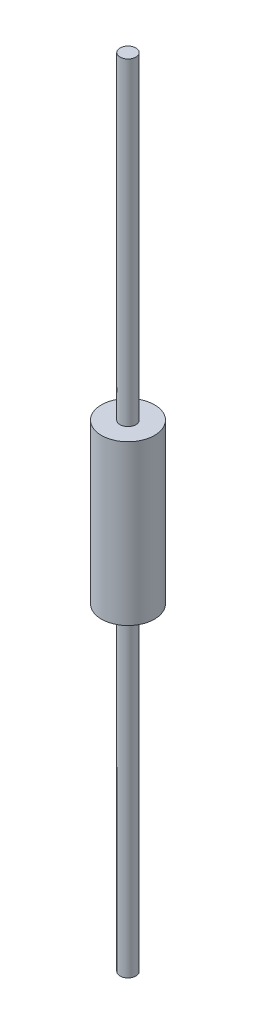
ISO-10303-21;
HEADER;
FILE_DESCRIPTION(('STEP AP214'),'2;1');
FILE_NAME('part.step','',(''),(''),'','','');
FILE_SCHEMA(('AUTOMOTIVE_DESIGN { 1 0 10303 214 1 1 1 1 }'));
ENDSEC;
DATA;
#1=APPLICATION_CONTEXT('core data for automotive mechanical design processes');
#2=APPLICATION_PROTOCOL_DEFINITION('international standard','automotive_design',2000,#1);
#3=PRODUCT_CONTEXT('',#1,'mechanical');
#4=PRODUCT('Part','Part','',(#3));
#5=PRODUCT_RELATED_PRODUCT_CATEGORY('part','',(#4));
#6=PRODUCT_DEFINITION_FORMATION('','',#4);
#7=PRODUCT_DEFINITION_CONTEXT('part definition',#1,'design');
#8=PRODUCT_DEFINITION('design','',#6,#7);
#9=PRODUCT_DEFINITION_SHAPE('','',#8);
#10=(LENGTH_UNIT() NAMED_UNIT(*) SI_UNIT(.MILLI.,.METRE.));
#11=(NAMED_UNIT(*) PLANE_ANGLE_UNIT() SI_UNIT($,.RADIAN.));
#12=(NAMED_UNIT(*) SI_UNIT($,.STERADIAN.) SOLID_ANGLE_UNIT());
#13=UNCERTAINTY_MEASURE_WITH_UNIT(LENGTH_MEASURE(1.E-05),#10,'distance_accuracy_value','');
#14=(GEOMETRIC_REPRESENTATION_CONTEXT(3) GLOBAL_UNCERTAINTY_ASSIGNED_CONTEXT((#13)) GLOBAL_UNIT_ASSIGNED_CONTEXT((#10,
#11,#12)) REPRESENTATION_CONTEXT('',''));
#15=CARTESIAN_POINT('',(0.,0.,0.));
#16=DIRECTION('',(0.,0.,1.));
#17=DIRECTION('',(1.,0.,0.));
#18=AXIS2_PLACEMENT_3D('',#15,#16,#17);
#19=CARTESIAN_POINT('',(0.,3.,0.));
#20=DIRECTION('',(0.,-1.,0.));
#21=DIRECTION('',(0.,0.,-1.));
#22=AXIS2_PLACEMENT_3D('',#19,#20,#21);
#23=CYLINDRICAL_SURFACE('',#22,0.5);
#24=CARTESIAN_POINT('',(0.,3.,0.));
#25=DIRECTION('',(0.,1.,0.));
#26=DIRECTION('',(0.,0.,1.));
#27=AXIS2_PLACEMENT_3D('',#24,#25,#26);
#28=CIRCLE('',#27,0.5);
#29=CARTESIAN_POINT('',(0.,3.,0.5));
#30=VERTEX_POINT('',#29);
#31=EDGE_CURVE('E42',#30,#30,#28,.T.);
#32=ORIENTED_EDGE('',*,*,#31,.F.);
#33=EDGE_LOOP('',(#32));
#34=FACE_BOUND('',#33,.T.);
#35=CARTESIAN_POINT('',(0.,0.,0.));
#36=DIRECTION('',(0.,1.,0.));
#37=DIRECTION('',(0.,0.,1.));
#38=AXIS2_PLACEMENT_3D('',#35,#36,#37);
#39=CIRCLE('',#38,0.5);
#40=CARTESIAN_POINT('',(0.,0.,0.5));
#41=VERTEX_POINT('',#40);
#42=EDGE_CURVE('E33',#41,#41,#39,.T.);
#43=ORIENTED_EDGE('',*,*,#42,.T.);
#44=EDGE_LOOP('',(#43));
#45=FACE_BOUND('',#44,.T.);
#46=ADVANCED_FACE('F30',(#34,#45),#23,.T.);
#47=CARTESIAN_POINT('',(0.,3.,0.));
#48=DIRECTION('',(0.,1.,0.));
#49=DIRECTION('',(0.,0.,1.));
#50=AXIS2_PLACEMENT_3D('',#47,#48,#49);
#51=PLANE('',#50);
#52=CARTESIAN_POINT('',(0.,3.,0.));
#53=DIRECTION('',(0.,1.,0.));
#54=DIRECTION('',(0.,0.,1.));
#55=AXIS2_PLACEMENT_3D('',#52,#53,#54);
#56=CIRCLE('',#55,0.15);
#57=CARTESIAN_POINT('',(0.,3.,0.15));
#58=VERTEX_POINT('',#57);
#59=EDGE_CURVE('E37',#58,#58,#56,.T.);
#60=ORIENTED_EDGE('',*,*,#59,.F.);
#61=EDGE_LOOP('',(#60));
#62=FACE_BOUND('',#61,.T.);
#63=ORIENTED_EDGE('',*,*,#31,.T.);
#64=EDGE_LOOP('',(#63));
#65=FACE_BOUND('',#64,.T.);
#66=ADVANCED_FACE('F59',(#62,#65),#51,.T.);
#67=CARTESIAN_POINT('',(0.,0.,0.));
#68=DIRECTION('',(0.,1.,0.));
#69=DIRECTION('',(0.,0.,1.));
#70=AXIS2_PLACEMENT_3D('',#67,#68,#69);
#71=PLANE('',#70);
#72=CARTESIAN_POINT('',(0.,0.,0.));
#73=DIRECTION('',(0.,-1.,0.));
#74=DIRECTION('',(0.,0.,-1.));
#75=AXIS2_PLACEMENT_3D('',#72,#73,#74);
#76=CIRCLE('',#75,0.15);
#77=CARTESIAN_POINT('',(0.,0.,-0.15));
#78=VERTEX_POINT('',#77);
#79=EDGE_CURVE('E10',#78,#78,#76,.T.);
#80=ORIENTED_EDGE('',*,*,#79,.F.);
#81=EDGE_LOOP('',(#80));
#82=FACE_BOUND('',#81,.T.);
#83=ORIENTED_EDGE('',*,*,#42,.F.);
#84=EDGE_LOOP('',(#83));
#85=FACE_BOUND('',#84,.T.);
#86=ADVANCED_FACE('F56',(#82,#85),#71,.F.);
#87=CARTESIAN_POINT('',(0.,9.,0.));
#88=DIRECTION('',(0.,-1.,0.));
#89=DIRECTION('',(0.,0.,-1.));
#90=AXIS2_PLACEMENT_3D('',#87,#88,#89);
#91=CYLINDRICAL_SURFACE('',#90,0.15);
#92=CARTESIAN_POINT('',(0.,9.,0.));
#93=DIRECTION('',(0.,1.,0.));
#94=DIRECTION('',(0.,0.,1.));
#95=AXIS2_PLACEMENT_3D('',#92,#93,#94);
#96=CIRCLE('',#95,0.15);
#97=CARTESIAN_POINT('',(0.,9.,0.15));
#98=VERTEX_POINT('',#97);
#99=EDGE_CURVE('E47',#98,#98,#96,.T.);
#100=ORIENTED_EDGE('',*,*,#99,.F.);
#101=EDGE_LOOP('',(#100));
#102=FACE_BOUND('',#101,.T.);
#103=ORIENTED_EDGE('',*,*,#59,.T.);
#104=EDGE_LOOP('',(#103));
#105=FACE_BOUND('',#104,.T.);
#106=ADVANCED_FACE('F58',(#102,#105),#91,.T.);
#107=CARTESIAN_POINT('',(0.,9.,0.));
#108=DIRECTION('',(0.,1.,0.));
#109=DIRECTION('',(0.,0.,1.));
#110=AXIS2_PLACEMENT_3D('',#107,#108,#109);
#111=PLANE('',#110);
#112=ORIENTED_EDGE('',*,*,#99,.T.);
#113=EDGE_LOOP('',(#112));
#114=FACE_BOUND('',#113,.T.);
#115=ADVANCED_FACE('F65',(#114),#111,.T.);
#116=CARTESIAN_POINT('',(0.,-6.,0.));
#117=DIRECTION('',(0.,1.,0.));
#118=DIRECTION('',(0.,0.,1.));
#119=AXIS2_PLACEMENT_3D('',#116,#117,#118);
#120=CYLINDRICAL_SURFACE('',#119,0.15);
#121=CARTESIAN_POINT('',(0.,-6.,0.));
#122=DIRECTION('',(0.,-1.,0.));
#123=DIRECTION('',(0.,0.,-1.));
#124=AXIS2_PLACEMENT_3D('',#121,#122,#123);
#125=CIRCLE('',#124,0.15);
#126=CARTESIAN_POINT('',(0.,-6.,-0.15));
#127=VERTEX_POINT('',#126);
#128=EDGE_CURVE('E46',#127,#127,#125,.T.);
#129=ORIENTED_EDGE('',*,*,#128,.F.);
#130=EDGE_LOOP('',(#129));
#131=FACE_BOUND('',#130,.T.);
#132=ORIENTED_EDGE('',*,*,#79,.T.);
#133=EDGE_LOOP('',(#132));
#134=FACE_BOUND('',#133,.T.);
#135=ADVANCED_FACE('F93',(#131,#134),#120,.T.);
#136=CARTESIAN_POINT('',(0.,-6.,0.));
#137=DIRECTION('',(0.,-1.,0.));
#138=DIRECTION('',(0.,0.,-1.));
#139=AXIS2_PLACEMENT_3D('',#136,#137,#138);
#140=PLANE('',#139);
#141=ORIENTED_EDGE('',*,*,#128,.T.);
#142=EDGE_LOOP('',(#141));
#143=FACE_BOUND('',#142,.T.);
#144=ADVANCED_FACE('F107',(#143),#140,.T.);
#145=CLOSED_SHELL('',(#46,#66,#86,#106,#115,#135,#144));
#146=MANIFOLD_SOLID_BREP('B2',#145);
#147=ADVANCED_BREP_SHAPE_REPRESENTATION('',(#18,#146),#14);
#148=SHAPE_DEFINITION_REPRESENTATION(#9,#147);
ENDSEC;
END-ISO-10303-21;
